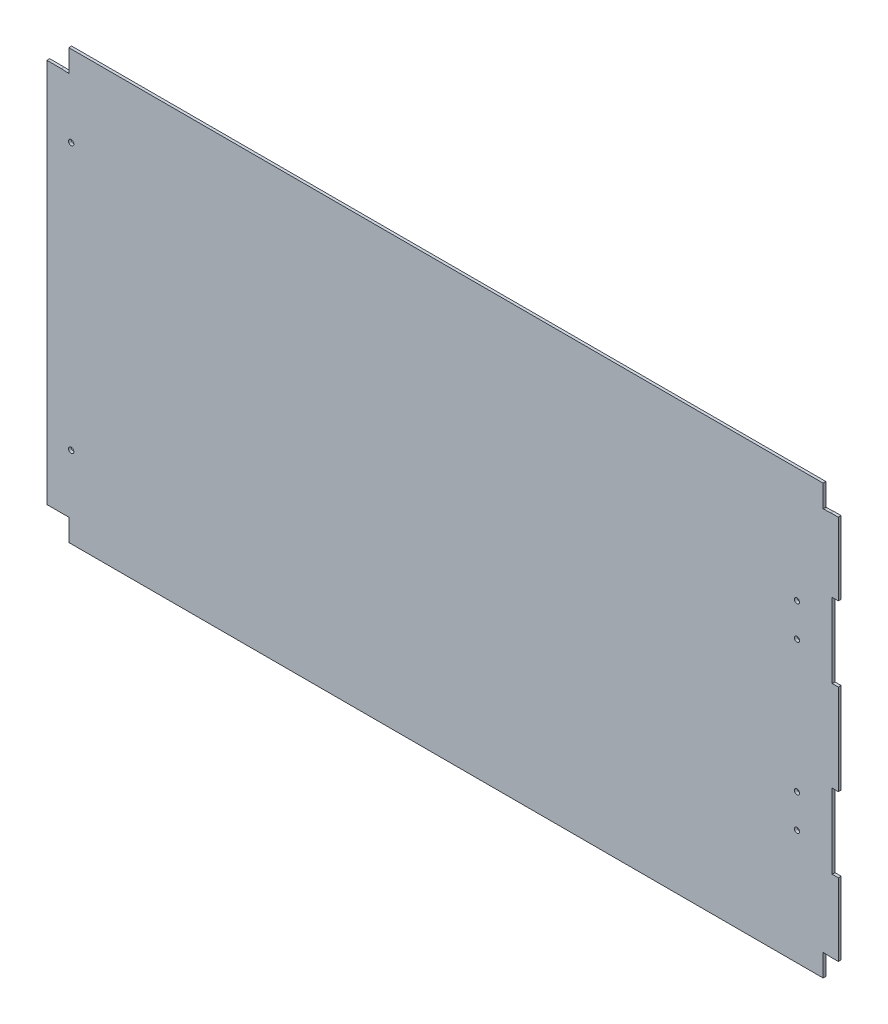
ISO-10303-21;
HEADER;
FILE_DESCRIPTION(('STEP AP214'),'2;1');
FILE_NAME('part.step','',(''),(''),'','','');
FILE_SCHEMA(('AUTOMOTIVE_DESIGN { 1 0 10303 214 1 1 1 1 }'));
ENDSEC;
DATA;
#1=APPLICATION_CONTEXT('core data for automotive mechanical design processes');
#2=APPLICATION_PROTOCOL_DEFINITION('international standard','automotive_design',2000,#1);
#3=PRODUCT_CONTEXT('',#1,'mechanical');
#4=PRODUCT('Part','Part','',(#3));
#5=PRODUCT_RELATED_PRODUCT_CATEGORY('part','',(#4));
#6=PRODUCT_DEFINITION_FORMATION('','',#4);
#7=PRODUCT_DEFINITION_CONTEXT('part definition',#1,'design');
#8=PRODUCT_DEFINITION('design','',#6,#7);
#9=PRODUCT_DEFINITION_SHAPE('','',#8);
#10=(LENGTH_UNIT() NAMED_UNIT(*) SI_UNIT(.MILLI.,.METRE.));
#11=(NAMED_UNIT(*) PLANE_ANGLE_UNIT() SI_UNIT($,.RADIAN.));
#12=(NAMED_UNIT(*) SI_UNIT($,.STERADIAN.) SOLID_ANGLE_UNIT());
#13=UNCERTAINTY_MEASURE_WITH_UNIT(LENGTH_MEASURE(1.E-05),#10,'distance_accuracy_value','');
#14=(GEOMETRIC_REPRESENTATION_CONTEXT(3) GLOBAL_UNCERTAINTY_ASSIGNED_CONTEXT((#13)) GLOBAL_UNIT_ASSIGNED_CONTEXT((#10,
#11,#12)) REPRESENTATION_CONTEXT('',''));
#15=CARTESIAN_POINT('',(0.,0.,0.));
#16=DIRECTION('',(0.,0.,1.));
#17=DIRECTION('',(1.,0.,0.));
#18=AXIS2_PLACEMENT_3D('',#15,#16,#17);
#19=CARTESIAN_POINT('',(0.,0.,-2.667));
#20=DIRECTION('',(0.,0.,-1.));
#21=DIRECTION('',(-1.,0.,0.));
#22=AXIS2_PLACEMENT_3D('',#19,#20,#21);
#23=PLANE('',#22);
#24=CARTESIAN_POINT('',(-357.251,-127.,-2.66700000000004));
#25=DIRECTION('',(0.,0.,1.));
#26=DIRECTION('',(1.,0.,0.));
#27=AXIS2_PLACEMENT_3D('',#24,#25,#26);
#28=CIRCLE('',#27,2.54000000000001);
#29=CARTESIAN_POINT('',(-354.711,-127.,-2.66700000000004));
#30=VERTEX_POINT('',#29);
#31=EDGE_CURVE('E489',#30,#30,#28,.T.);
#32=ORIENTED_EDGE('',*,*,#31,.T.);
#33=EDGE_LOOP('',(#32));
#34=FACE_BOUND('',#33,.T.);
#35=CARTESIAN_POINT('',(334.645,62.992,-2.66700000000004));
#36=DIRECTION('',(0.,0.,1.));
#37=DIRECTION('',(1.,0.,0.));
#38=AXIS2_PLACEMENT_3D('',#35,#36,#37);
#39=CIRCLE('',#38,2.41299999999999);
#40=CARTESIAN_POINT('',(337.058,62.992,-2.66700000000004));
#41=VERTEX_POINT('',#40);
#42=EDGE_CURVE('E512',#41,#41,#39,.T.);
#43=ORIENTED_EDGE('',*,*,#42,.T.);
#44=EDGE_LOOP('',(#43));
#45=FACE_BOUND('',#44,.T.);
#46=CARTESIAN_POINT('',(334.645,-62.9920000000001,-2.66700000000004));
#47=DIRECTION('',(0.,0.,1.));
#48=DIRECTION('',(1.,0.,0.));
#49=AXIS2_PLACEMENT_3D('',#46,#47,#48);
#50=CIRCLE('',#49,2.41299999999999);
#51=CARTESIAN_POINT('',(337.058,-62.9920000000001,-2.66700000000004));
#52=VERTEX_POINT('',#51);
#53=EDGE_CURVE('E497',#52,#52,#50,.T.);
#54=ORIENTED_EDGE('',*,*,#53,.T.);
#55=EDGE_LOOP('',(#54));
#56=FACE_BOUND('',#55,.T.);
#57=CARTESIAN_POINT('',(334.645,-94.7420000000001,-2.66700000000004));
#58=DIRECTION('',(0.,0.,1.));
#59=DIRECTION('',(1.,0.,0.));
#60=AXIS2_PLACEMENT_3D('',#57,#58,#59);
#61=CIRCLE('',#60,2.41299999999999);
#62=CARTESIAN_POINT('',(337.058,-94.7420000000001,-2.66700000000004));
#63=VERTEX_POINT('',#62);
#64=EDGE_CURVE('E498',#63,#63,#61,.T.);
#65=ORIENTED_EDGE('',*,*,#64,.T.);
#66=EDGE_LOOP('',(#65));
#67=FACE_BOUND('',#66,.T.);
#68=CARTESIAN_POINT('',(-357.251,127.,-2.66700000000004));
#69=DIRECTION('',(0.,0.,1.));
#70=DIRECTION('',(1.,0.,0.));
#71=AXIS2_PLACEMENT_3D('',#68,#69,#70);
#72=CIRCLE('',#71,2.54000000000001);
#73=CARTESIAN_POINT('',(-354.711,127.,-2.66700000000004));
#74=VERTEX_POINT('',#73);
#75=EDGE_CURVE('E504',#74,#74,#72,.T.);
#76=ORIENTED_EDGE('',*,*,#75,.T.);
#77=EDGE_LOOP('',(#76));
#78=FACE_BOUND('',#77,.T.);
#79=CARTESIAN_POINT('',(334.645,94.742,-2.66700000000004));
#80=DIRECTION('',(0.,0.,1.));
#81=DIRECTION('',(1.,0.,0.));
#82=AXIS2_PLACEMENT_3D('',#79,#80,#81);
#83=CIRCLE('',#82,2.41299999999999);
#84=CARTESIAN_POINT('',(337.058,94.742,-2.66700000000004));
#85=VERTEX_POINT('',#84);
#86=EDGE_CURVE('E524',#85,#85,#83,.T.);
#87=ORIENTED_EDGE('',*,*,#86,.T.);
#88=EDGE_LOOP('',(#87));
#89=FACE_BOUND('',#88,.T.);
#90=DIRECTION('',(1.,0.,0.));
#91=VECTOR('',#90,1.);
#92=CARTESIAN_POINT('',(0.,183.0705,-2.667));
#93=LINE('',#92,#91);
#94=CARTESIAN_POINT('',(359.537,183.0705,-2.667));
#95=VERTEX_POINT('',#94);
#96=CARTESIAN_POINT('',(360.553,183.0705,-2.66700000000004));
#97=VERTEX_POINT('',#96);
#98=EDGE_CURVE('E527',#95,#97,#93,.T.);
#99=ORIENTED_EDGE('',*,*,#98,.T.);
#100=DIRECTION('',(0.998673606846103,0.0514881247376041,0.));
#101=VECTOR('',#100,1.);
#102=CARTESIAN_POINT('',(360.553,183.0705,-2.66700000000001));
#103=LINE('',#102,#101);
#104=CARTESIAN_POINT('',(366.711291291236,183.388,-2.66700000000001));
#105=VERTEX_POINT('',#104);
#106=EDGE_CURVE('E482',#97,#105,#103,.T.);
#107=ORIENTED_EDGE('',*,*,#106,.T.);
#108=DIRECTION('',(1.,0.,0.));
#109=VECTOR('',#108,1.);
#110=CARTESIAN_POINT('',(364.044291291234,183.388,-2.66700000000003));
#111=LINE('',#110,#109);
#112=CARTESIAN_POINT('',(374.077291291236,183.388,-2.66700000000014));
#113=VERTEX_POINT('',#112);
#114=EDGE_CURVE('E432',#105,#113,#111,.T.);
#115=ORIENTED_EDGE('',*,*,#114,.T.);
#116=DIRECTION('',(0.,-1.,0.));
#117=VECTOR('',#116,1.);
#118=CARTESIAN_POINT('',(374.077291291236,0.,-2.66700000000009));
#119=LINE('',#118,#117);
#120=CARTESIAN_POINT('',(374.077291291236,114.3,-2.66700000000009));
#121=VERTEX_POINT('',#120);
#122=EDGE_CURVE('E429',#113,#121,#119,.T.);
#123=ORIENTED_EDGE('',*,*,#122,.T.);
#124=DIRECTION('',(1.,0.,0.));
#125=VECTOR('',#124,1.);
#126=CARTESIAN_POINT('',(374.077291291236,114.3,-2.66700000000009));
#127=LINE('',#126,#125);
#128=CARTESIAN_POINT('',(368.235291291236,114.3,-2.66699999999997));
#129=VERTEX_POINT('',#128);
#130=EDGE_CURVE('E456',#129,#121,#127,.T.);
#131=ORIENTED_EDGE('',*,*,#130,.F.);
#132=DIRECTION('',(0.,1.,0.));
#133=VECTOR('',#132,1.);
#134=CARTESIAN_POINT('',(368.235291291236,114.3,-2.66699999999997));
#135=LINE('',#134,#133);
#136=CARTESIAN_POINT('',(368.235291291236,43.18,-2.66699999999997));
#137=VERTEX_POINT('',#136);
#138=EDGE_CURVE('E438',#137,#129,#135,.T.);
#139=ORIENTED_EDGE('',*,*,#138,.F.);
#140=DIRECTION('',(-1.,0.,0.));
#141=VECTOR('',#140,1.);
#142=CARTESIAN_POINT('',(374.077291291236,43.18,-2.66700000000009));
#143=LINE('',#142,#141);
#144=CARTESIAN_POINT('',(374.077291291236,43.18,-2.66700000000009));
#145=VERTEX_POINT('',#144);
#146=EDGE_CURVE('E443',#145,#137,#143,.T.);
#147=ORIENTED_EDGE('',*,*,#146,.F.);
#148=CARTESIAN_POINT('',(374.077291291236,-43.1800000000001,-2.66700000000009));
#149=VERTEX_POINT('',#148);
#150=EDGE_CURVE('E434',#145,#149,#119,.T.);
#151=ORIENTED_EDGE('',*,*,#150,.T.);
#152=DIRECTION('',(1.,0.,0.));
#153=VECTOR('',#152,1.);
#154=CARTESIAN_POINT('',(374.077291291236,-43.1800000000001,-2.66700000000009));
#155=LINE('',#154,#153);
#156=CARTESIAN_POINT('',(368.235291291236,-43.1800000000001,-2.66699999999997));
#157=VERTEX_POINT('',#156);
#158=EDGE_CURVE('E458',#157,#149,#155,.T.);
#159=ORIENTED_EDGE('',*,*,#158,.F.);
#160=DIRECTION('',(0.,1.,0.));
#161=VECTOR('',#160,1.);
#162=CARTESIAN_POINT('',(368.235291291236,-114.3,-2.66699999999997));
#163=LINE('',#162,#161);
#164=CARTESIAN_POINT('',(368.235291291236,-114.3,-2.66699999999997));
#165=VERTEX_POINT('',#164);
#166=EDGE_CURVE('E462',#165,#157,#163,.T.);
#167=ORIENTED_EDGE('',*,*,#166,.F.);
#168=DIRECTION('',(-1.,0.,0.));
#169=VECTOR('',#168,1.);
#170=CARTESIAN_POINT('',(374.077291291236,-114.3,-2.66700000000009));
#171=LINE('',#170,#169);
#172=CARTESIAN_POINT('',(374.077291291236,-114.3,-2.66700000000009));
#173=VERTEX_POINT('',#172);
#174=EDGE_CURVE('E467',#173,#165,#171,.T.);
#175=ORIENTED_EDGE('',*,*,#174,.F.);
#176=CARTESIAN_POINT('',(374.077291291236,-183.388,-2.66700000000003));
#177=VERTEX_POINT('',#176);
#178=EDGE_CURVE('E433',#173,#177,#119,.T.);
#179=ORIENTED_EDGE('',*,*,#178,.T.);
#180=DIRECTION('',(-1.,0.,0.));
#181=VECTOR('',#180,1.);
#182=CARTESIAN_POINT('',(364.044291291234,-183.388,-2.66699999999992));
#183=LINE('',#182,#181);
#184=CARTESIAN_POINT('',(366.711291291236,-183.388,-2.66699999999992));
#185=VERTEX_POINT('',#184);
#186=EDGE_CURVE('E436',#177,#185,#183,.T.);
#187=ORIENTED_EDGE('',*,*,#186,.T.);
#188=DIRECTION('',(-0.998673606846104,0.0514881247375951,0.));
#189=VECTOR('',#188,1.);
#190=CARTESIAN_POINT('',(366.711291291236,-183.388,-2.66700000000001));
#191=LINE('',#190,#189);
#192=CARTESIAN_POINT('',(360.553,-183.0705,-2.66700000000001));
#193=VERTEX_POINT('',#192);
#194=EDGE_CURVE('E485',#185,#193,#191,.T.);
#195=ORIENTED_EDGE('',*,*,#194,.T.);
#196=DIRECTION('',(-1.,0.,0.));
#197=VECTOR('',#196,1.);
#198=CARTESIAN_POINT('',(0.,-183.0705,-2.667));
#199=LINE('',#198,#197);
#200=CARTESIAN_POINT('',(359.537,-183.0705,-2.667));
#201=VERTEX_POINT('',#200);
#202=EDGE_CURVE('E545',#193,#201,#199,.T.);
#203=ORIENTED_EDGE('',*,*,#202,.T.);
#204=DIRECTION('',(0.,-1.,0.));
#205=VECTOR('',#204,1.);
#206=CARTESIAN_POINT('',(359.537,-189.738,-2.667));
#207=LINE('',#206,#205);
#208=CARTESIAN_POINT('',(359.537,-204.278291291236,-2.66700000000006));
#209=VERTEX_POINT('',#208);
#210=EDGE_CURVE('E543',#201,#209,#207,.T.);
#211=ORIENTED_EDGE('',*,*,#210,.T.);
#212=DIRECTION('',(1.,0.,0.));
#213=VECTOR('',#212,1.);
#214=CARTESIAN_POINT('',(359.537,-204.278291291236,-2.66700000000006));
#215=LINE('',#214,#213);
#216=CARTESIAN_POINT('',(-359.537,-204.278291291236,-2.66700000000011));
#217=VERTEX_POINT('',#216);
#218=EDGE_CURVE('E372',#217,#209,#215,.T.);
#219=ORIENTED_EDGE('',*,*,#218,.F.);
#220=DIRECTION('',(0.,-1.,0.));
#221=VECTOR('',#220,1.);
#222=CARTESIAN_POINT('',(-359.537,-204.278291291236,-2.66700000000011));
#223=LINE('',#222,#221);
#224=CARTESIAN_POINT('',(-359.537,-190.562291291236,-2.667));
#225=VERTEX_POINT('',#224);
#226=EDGE_CURVE('E379',#225,#217,#223,.T.);
#227=ORIENTED_EDGE('',*,*,#226,.F.);
#228=DIRECTION('',(0.0514881247375944,0.998673606846104,0.));
#229=VECTOR('',#228,1.);
#230=CARTESIAN_POINT('',(-359.537,-190.562291291236,-2.66699999999998));
#231=LINE('',#230,#229);
#232=CARTESIAN_POINT('',(-359.2195,-184.404,-2.66699999999998));
#233=VERTEX_POINT('',#232);
#234=EDGE_CURVE('E394',#225,#233,#231,.T.);
#235=ORIENTED_EDGE('',*,*,#234,.T.);
#236=DIRECTION('',(0.,1.,0.));
#237=VECTOR('',#236,1.);
#238=CARTESIAN_POINT('',(-359.2195,0.,-2.667));
#239=LINE('',#238,#237);
#240=CARTESIAN_POINT('',(-359.2195,-183.388,-2.667));
#241=VERTEX_POINT('',#240);
#242=EDGE_CURVE('E539',#233,#241,#239,.T.);
#243=ORIENTED_EDGE('',*,*,#242,.T.);
#244=DIRECTION('',(-1.,0.,0.));
#245=VECTOR('',#244,1.);
#246=CARTESIAN_POINT('',(-365.887,-183.388,-2.667));
#247=LINE('',#246,#245);
#248=CARTESIAN_POINT('',(-380.427291291236,-183.388,-2.6670000000002));
#249=VERTEX_POINT('',#248);
#250=EDGE_CURVE('E537',#241,#249,#247,.T.);
#251=ORIENTED_EDGE('',*,*,#250,.T.);
#252=DIRECTION('',(0.,-1.,0.));
#253=VECTOR('',#252,1.);
#254=CARTESIAN_POINT('',(-380.427291291236,-183.388,-2.6670000000002));
#255=LINE('',#254,#253);
#256=CARTESIAN_POINT('',(-380.427291291236,183.388,-2.66700000000014));
#257=VERTEX_POINT('',#256);
#258=EDGE_CURVE('E341',#257,#249,#255,.T.);
#259=ORIENTED_EDGE('',*,*,#258,.F.);
#260=DIRECTION('',(-1.,0.,0.));
#261=VECTOR('',#260,1.);
#262=CARTESIAN_POINT('',(-380.427291291236,183.388,-2.66700000000014));
#263=LINE('',#262,#261);
#264=CARTESIAN_POINT('',(-366.711291291236,183.388,-2.66699999999992));
#265=VERTEX_POINT('',#264);
#266=EDGE_CURVE('E354',#265,#257,#263,.T.);
#267=ORIENTED_EDGE('',*,*,#266,.F.);
#268=DIRECTION('',(0.998673606846104,-0.0514881247375861,0.));
#269=VECTOR('',#268,1.);
#270=CARTESIAN_POINT('',(-366.711291291236,183.388,-2.66700000000001));
#271=LINE('',#270,#269);
#272=CARTESIAN_POINT('',(-360.553,183.0705,-2.66700000000001));
#273=VERTEX_POINT('',#272);
#274=EDGE_CURVE('E369',#265,#273,#271,.T.);
#275=ORIENTED_EDGE('',*,*,#274,.T.);
#276=DIRECTION('',(1.,0.,0.));
#277=VECTOR('',#276,1.);
#278=CARTESIAN_POINT('',(0.,183.0705,-2.667));
#279=LINE('',#278,#277);
#280=CARTESIAN_POINT('',(-359.537,183.0705,-2.667));
#281=VERTEX_POINT('',#280);
#282=EDGE_CURVE('E534',#273,#281,#279,.T.);
#283=ORIENTED_EDGE('',*,*,#282,.T.);
#284=DIRECTION('',(0.,1.,0.));
#285=VECTOR('',#284,1.);
#286=CARTESIAN_POINT('',(-359.537,189.738,-2.667));
#287=LINE('',#286,#285);
#288=CARTESIAN_POINT('',(-359.537,204.278291291236,-2.66700000000011));
#289=VERTEX_POINT('',#288);
#290=EDGE_CURVE('E332',#281,#289,#287,.T.);
#291=ORIENTED_EDGE('',*,*,#290,.T.);
#292=DIRECTION('',(-1.,0.,0.));
#293=VECTOR('',#292,1.);
#294=CARTESIAN_POINT('',(-359.537,204.278291291236,-2.66700000000011));
#295=LINE('',#294,#293);
#296=CARTESIAN_POINT('',(359.537,204.278291291236,-2.66700000000011));
#297=VERTEX_POINT('',#296);
#298=EDGE_CURVE('E338',#297,#289,#295,.T.);
#299=ORIENTED_EDGE('',*,*,#298,.F.);
#300=DIRECTION('',(0.,-1.,0.));
#301=VECTOR('',#300,1.);
#302=CARTESIAN_POINT('',(359.537,189.738,-2.667));
#303=LINE('',#302,#301);
#304=EDGE_CURVE('E321',#297,#95,#303,.T.);
#305=ORIENTED_EDGE('',*,*,#304,.T.);
#306=EDGE_LOOP('',(#99,#107,#115,#123,#131,#139,#147,#151,#159,#167,#175,#179,#187,#195,#203,
#211,#219,#227,#235,#243,#251,#259,#267,#275,#283,#291,#299,#305));
#307=FACE_BOUND('',#306,.T.);
#308=ADVANCED_FACE('F135',(#34,#45,#56,#67,#78,#89,#307),#23,.T.);
#309=CARTESIAN_POINT('',(0.,0.,0.));
#310=DIRECTION('',(0.,0.,-1.));
#311=DIRECTION('',(-1.,0.,0.));
#312=AXIS2_PLACEMENT_3D('',#309,#310,#311);
#313=PLANE('',#312);
#314=CARTESIAN_POINT('',(-357.251,-127.,0.));
#315=DIRECTION('',(0.,0.,1.));
#316=DIRECTION('',(1.,0.,0.));
#317=AXIS2_PLACEMENT_3D('',#314,#315,#316);
#318=CIRCLE('',#317,2.54000000000001);
#319=CARTESIAN_POINT('',(-354.711,-127.,0.));
#320=VERTEX_POINT('',#319);
#321=EDGE_CURVE('E507',#320,#320,#318,.T.);
#322=ORIENTED_EDGE('',*,*,#321,.F.);
#323=EDGE_LOOP('',(#322));
#324=FACE_BOUND('',#323,.T.);
#325=CARTESIAN_POINT('',(334.645,62.992,0.));
#326=DIRECTION('',(0.,0.,1.));
#327=DIRECTION('',(1.,0.,0.));
#328=AXIS2_PLACEMENT_3D('',#325,#326,#327);
#329=CIRCLE('',#328,2.41299999999999);
#330=CARTESIAN_POINT('',(337.058,62.992,0.));
#331=VERTEX_POINT('',#330);
#332=EDGE_CURVE('E508',#331,#331,#329,.T.);
#333=ORIENTED_EDGE('',*,*,#332,.F.);
#334=EDGE_LOOP('',(#333));
#335=FACE_BOUND('',#334,.T.);
#336=CARTESIAN_POINT('',(334.645,-62.9920000000001,0.));
#337=DIRECTION('',(0.,0.,1.));
#338=DIRECTION('',(1.,0.,0.));
#339=AXIS2_PLACEMENT_3D('',#336,#337,#338);
#340=CIRCLE('',#339,2.41299999999999);
#341=CARTESIAN_POINT('',(337.058,-62.9920000000001,0.));
#342=VERTEX_POINT('',#341);
#343=EDGE_CURVE('E515',#342,#342,#340,.T.);
#344=ORIENTED_EDGE('',*,*,#343,.F.);
#345=EDGE_LOOP('',(#344));
#346=FACE_BOUND('',#345,.T.);
#347=CARTESIAN_POINT('',(334.645,-94.7420000000001,0.));
#348=DIRECTION('',(0.,0.,1.));
#349=DIRECTION('',(1.,0.,0.));
#350=AXIS2_PLACEMENT_3D('',#347,#348,#349);
#351=CIRCLE('',#350,2.41299999999999);
#352=CARTESIAN_POINT('',(337.058,-94.7420000000001,0.));
#353=VERTEX_POINT('',#352);
#354=EDGE_CURVE('E494',#353,#353,#351,.T.);
#355=ORIENTED_EDGE('',*,*,#354,.F.);
#356=EDGE_LOOP('',(#355));
#357=FACE_BOUND('',#356,.T.);
#358=CARTESIAN_POINT('',(-357.251,127.,0.));
#359=DIRECTION('',(0.,0.,1.));
#360=DIRECTION('',(1.,0.,0.));
#361=AXIS2_PLACEMENT_3D('',#358,#359,#360);
#362=CIRCLE('',#361,2.54000000000001);
#363=CARTESIAN_POINT('',(-354.711,127.,0.));
#364=VERTEX_POINT('',#363);
#365=EDGE_CURVE('E501',#364,#364,#362,.T.);
#366=ORIENTED_EDGE('',*,*,#365,.F.);
#367=EDGE_LOOP('',(#366));
#368=FACE_BOUND('',#367,.T.);
#369=CARTESIAN_POINT('',(334.645,94.742,0.));
#370=DIRECTION('',(0.,0.,1.));
#371=DIRECTION('',(1.,0.,0.));
#372=AXIS2_PLACEMENT_3D('',#369,#370,#371);
#373=CIRCLE('',#372,2.41299999999999);
#374=CARTESIAN_POINT('',(337.058,94.742,0.));
#375=VERTEX_POINT('',#374);
#376=EDGE_CURVE('E511',#375,#375,#373,.T.);
#377=ORIENTED_EDGE('',*,*,#376,.F.);
#378=EDGE_LOOP('',(#377));
#379=FACE_BOUND('',#378,.T.);
#380=DIRECTION('',(-1.,0.,0.));
#381=VECTOR('',#380,1.);
#382=CARTESIAN_POINT('',(360.8705,-183.0705,0.));
#383=LINE('',#382,#381);
#384=CARTESIAN_POINT('',(360.553,-183.0705,0.));
#385=VERTEX_POINT('',#384);
#386=CARTESIAN_POINT('',(359.537,-183.0705,0.));
#387=VERTEX_POINT('',#386);
#388=EDGE_CURVE('E556',#385,#387,#383,.T.);
#389=ORIENTED_EDGE('',*,*,#388,.F.);
#390=DIRECTION('',(-0.998673606846104,0.0514881247375951,0.));
#391=VECTOR('',#390,1.);
#392=CARTESIAN_POINT('',(366.711291291236,-183.388,0.));
#393=LINE('',#392,#391);
#394=CARTESIAN_POINT('',(366.711291291236,-183.388,0.));
#395=VERTEX_POINT('',#394);
#396=EDGE_CURVE('E486',#395,#385,#393,.T.);
#397=ORIENTED_EDGE('',*,*,#396,.F.);
#398=DIRECTION('',(1.,0.,0.));
#399=VECTOR('',#398,1.);
#400=CARTESIAN_POINT('',(364.044291291236,-183.388,0.));
#401=LINE('',#400,#399);
#402=CARTESIAN_POINT('',(374.077291291236,-183.388,0.));
#403=VERTEX_POINT('',#402);
#404=EDGE_CURVE('E400',#403,#395,#401,.F.);
#405=ORIENTED_EDGE('',*,*,#404,.F.);
#406=DIRECTION('',(0.,1.,0.));
#407=VECTOR('',#406,1.);
#408=CARTESIAN_POINT('',(374.077291291236,-183.388,0.));
#409=LINE('',#408,#407);
#410=CARTESIAN_POINT('',(374.077291291236,-114.3,-1.11022302462516E-13));
#411=VERTEX_POINT('',#410);
#412=EDGE_CURVE('E457',#411,#403,#409,.F.);
#413=ORIENTED_EDGE('',*,*,#412,.F.);
#414=DIRECTION('',(-1.,0.,0.));
#415=VECTOR('',#414,1.);
#416=CARTESIAN_POINT('',(374.077291291236,-114.3,-1.11022302462516E-13));
#417=LINE('',#416,#415);
#418=CARTESIAN_POINT('',(368.235291291236,-114.3,0.));
#419=VERTEX_POINT('',#418);
#420=EDGE_CURVE('E415',#411,#419,#417,.T.);
#421=ORIENTED_EDGE('',*,*,#420,.T.);
#422=DIRECTION('',(0.,1.,0.));
#423=VECTOR('',#422,1.);
#424=CARTESIAN_POINT('',(368.235291291236,-114.3,0.));
#425=LINE('',#424,#423);
#426=CARTESIAN_POINT('',(368.235291291236,-43.1800000000001,0.));
#427=VERTEX_POINT('',#426);
#428=EDGE_CURVE('E412',#419,#427,#425,.T.);
#429=ORIENTED_EDGE('',*,*,#428,.T.);
#430=DIRECTION('',(1.,0.,0.));
#431=VECTOR('',#430,1.);
#432=CARTESIAN_POINT('',(374.077291291236,-43.1800000000001,-1.11022302462516E-13));
#433=LINE('',#432,#431);
#434=CARTESIAN_POINT('',(374.077291291236,-43.1800000000001,-1.11022302462516E-13));
#435=VERTEX_POINT('',#434);
#436=EDGE_CURVE('E409',#427,#435,#433,.T.);
#437=ORIENTED_EDGE('',*,*,#436,.T.);
#438=CARTESIAN_POINT('',(374.077291291236,43.18,-1.11022302462516E-13));
#439=VERTEX_POINT('',#438);
#440=EDGE_CURVE('E451',#439,#435,#409,.F.);
#441=ORIENTED_EDGE('',*,*,#440,.F.);
#442=DIRECTION('',(-1.,0.,0.));
#443=VECTOR('',#442,1.);
#444=CARTESIAN_POINT('',(374.077291291236,43.18,-1.11022302462516E-13));
#445=LINE('',#444,#443);
#446=CARTESIAN_POINT('',(368.235291291236,43.18,0.));
#447=VERTEX_POINT('',#446);
#448=EDGE_CURVE('E424',#439,#447,#445,.T.);
#449=ORIENTED_EDGE('',*,*,#448,.T.);
#450=DIRECTION('',(0.,1.,0.));
#451=VECTOR('',#450,1.);
#452=CARTESIAN_POINT('',(368.235291291236,114.3,0.));
#453=LINE('',#452,#451);
#454=CARTESIAN_POINT('',(368.235291291236,114.3,0.));
#455=VERTEX_POINT('',#454);
#456=EDGE_CURVE('E421',#447,#455,#453,.T.);
#457=ORIENTED_EDGE('',*,*,#456,.T.);
#458=DIRECTION('',(1.,0.,0.));
#459=VECTOR('',#458,1.);
#460=CARTESIAN_POINT('',(374.077291291236,114.3,-1.11022302462516E-13));
#461=LINE('',#460,#459);
#462=CARTESIAN_POINT('',(374.077291291236,114.3,-1.11022302462516E-13));
#463=VERTEX_POINT('',#462);
#464=EDGE_CURVE('E418',#455,#463,#461,.T.);
#465=ORIENTED_EDGE('',*,*,#464,.T.);
#466=CARTESIAN_POINT('',(374.077291291236,183.388,-1.66533453693773E-13));
#467=VERTEX_POINT('',#466);
#468=EDGE_CURVE('E452',#467,#463,#409,.F.);
#469=ORIENTED_EDGE('',*,*,#468,.F.);
#470=DIRECTION('',(-1.,0.,0.));
#471=VECTOR('',#470,1.);
#472=CARTESIAN_POINT('',(374.077291291236,183.388,-1.66533453693773E-13));
#473=LINE('',#472,#471);
#474=CARTESIAN_POINT('',(366.711291291236,183.388,0.));
#475=VERTEX_POINT('',#474);
#476=EDGE_CURVE('E427',#475,#467,#473,.F.);
#477=ORIENTED_EDGE('',*,*,#476,.F.);
#478=DIRECTION('',(0.998673606846103,0.0514881247376041,0.));
#479=VECTOR('',#478,1.);
#480=CARTESIAN_POINT('',(360.553,183.0705,0.));
#481=LINE('',#480,#479);
#482=CARTESIAN_POINT('',(360.553,183.0705,0.));
#483=VERTEX_POINT('',#482);
#484=EDGE_CURVE('E402',#483,#475,#481,.T.);
#485=ORIENTED_EDGE('',*,*,#484,.F.);
#486=DIRECTION('',(1.,0.,0.));
#487=VECTOR('',#486,1.);
#488=CARTESIAN_POINT('',(359.537,183.0705,0.));
#489=LINE('',#488,#487);
#490=CARTESIAN_POINT('',(359.537,183.0705,0.));
#491=VERTEX_POINT('',#490);
#492=EDGE_CURVE('E331',#491,#483,#489,.T.);
#493=ORIENTED_EDGE('',*,*,#492,.F.);
#494=DIRECTION('',(0.,-1.,0.));
#495=VECTOR('',#494,1.);
#496=CARTESIAN_POINT('',(359.537,189.738,0.));
#497=LINE('',#496,#495);
#498=CARTESIAN_POINT('',(359.537,204.278291291236,-1.11022302462516E-13));
#499=VERTEX_POINT('',#498);
#500=EDGE_CURVE('E532',#499,#491,#497,.T.);
#501=ORIENTED_EDGE('',*,*,#500,.F.);
#502=DIRECTION('',(1.,0.,0.));
#503=VECTOR('',#502,1.);
#504=CARTESIAN_POINT('',(0.,204.278291291236,-1.11022302462516E-13));
#505=LINE('',#504,#503);
#506=CARTESIAN_POINT('',(-359.537,204.278291291236,-1.11022302462516E-13));
#507=VERTEX_POINT('',#506);
#508=EDGE_CURVE('E340',#499,#507,#505,.F.);
#509=ORIENTED_EDGE('',*,*,#508,.T.);
#510=DIRECTION('',(0.,1.,0.));
#511=VECTOR('',#510,1.);
#512=CARTESIAN_POINT('',(-359.537,189.738,0.));
#513=LINE('',#512,#511);
#514=CARTESIAN_POINT('',(-359.537,183.0705,0.));
#515=VERTEX_POINT('',#514);
#516=EDGE_CURVE('E530',#515,#507,#513,.T.);
#517=ORIENTED_EDGE('',*,*,#516,.F.);
#518=DIRECTION('',(1.,0.,0.));
#519=VECTOR('',#518,1.);
#520=CARTESIAN_POINT('',(-360.8705,183.0705,0.));
#521=LINE('',#520,#519);
#522=CARTESIAN_POINT('',(-360.553,183.0705,0.));
#523=VERTEX_POINT('',#522);
#524=EDGE_CURVE('E150',#523,#515,#521,.T.);
#525=ORIENTED_EDGE('',*,*,#524,.F.);
#526=DIRECTION('',(0.998673606846104,-0.0514881247375861,0.));
#527=VECTOR('',#526,1.);
#528=CARTESIAN_POINT('',(-366.711291291236,183.388,0.));
#529=LINE('',#528,#527);
#530=CARTESIAN_POINT('',(-366.711291291236,183.388,0.));
#531=VERTEX_POINT('',#530);
#532=EDGE_CURVE('E353',#531,#523,#529,.T.);
#533=ORIENTED_EDGE('',*,*,#532,.F.);
#534=DIRECTION('',(1.,0.,0.));
#535=VECTOR('',#534,1.);
#536=CARTESIAN_POINT('',(-364.044291291232,183.388,0.));
#537=LINE('',#536,#535);
#538=CARTESIAN_POINT('',(-380.427291291236,183.388,-1.11022302462516E-13));
#539=VERTEX_POINT('',#538);
#540=EDGE_CURVE('E362',#531,#539,#537,.F.);
#541=ORIENTED_EDGE('',*,*,#540,.T.);
#542=DIRECTION('',(0.,1.,0.));
#543=VECTOR('',#542,1.);
#544=CARTESIAN_POINT('',(-380.427291291236,0.,-1.66533453693773E-13));
#545=LINE('',#544,#543);
#546=CARTESIAN_POINT('',(-380.427291291236,-183.388,-2.22044604925031E-13));
#547=VERTEX_POINT('',#546);
#548=EDGE_CURVE('E359',#539,#547,#545,.F.);
#549=ORIENTED_EDGE('',*,*,#548,.T.);
#550=DIRECTION('',(-1.,0.,0.));
#551=VECTOR('',#550,1.);
#552=CARTESIAN_POINT('',(-365.887,-183.388,0.));
#553=LINE('',#552,#551);
#554=CARTESIAN_POINT('',(-359.2195,-183.388,0.));
#555=VERTEX_POINT('',#554);
#556=EDGE_CURVE('E540',#555,#547,#553,.T.);
#557=ORIENTED_EDGE('',*,*,#556,.F.);
#558=DIRECTION('',(0.,1.,0.));
#559=VECTOR('',#558,1.);
#560=CARTESIAN_POINT('',(-359.2195,-184.7215,0.));
#561=LINE('',#560,#559);
#562=CARTESIAN_POINT('',(-359.2195,-184.404,0.));
#563=VERTEX_POINT('',#562);
#564=EDGE_CURVE('E157',#563,#555,#561,.T.);
#565=ORIENTED_EDGE('',*,*,#564,.F.);
#566=DIRECTION('',(0.0514881247375944,0.998673606846104,0.));
#567=VECTOR('',#566,1.);
#568=CARTESIAN_POINT('',(-359.537,-190.562291291236,0.));
#569=LINE('',#568,#567);
#570=CARTESIAN_POINT('',(-359.537,-190.562291291236,0.));
#571=VERTEX_POINT('',#570);
#572=EDGE_CURVE('E378',#571,#563,#569,.T.);
#573=ORIENTED_EDGE('',*,*,#572,.F.);
#574=DIRECTION('',(0.,1.,0.));
#575=VECTOR('',#574,1.);
#576=CARTESIAN_POINT('',(-359.537,-187.895291291236,0.));
#577=LINE('',#576,#575);
#578=CARTESIAN_POINT('',(-359.537,-204.278291291236,-1.11022302462516E-13));
#579=VERTEX_POINT('',#578);
#580=EDGE_CURVE('E387',#571,#579,#577,.F.);
#581=ORIENTED_EDGE('',*,*,#580,.T.);
#582=DIRECTION('',(-1.,0.,0.));
#583=VECTOR('',#582,1.);
#584=CARTESIAN_POINT('',(0.,-204.278291291236,0.));
#585=LINE('',#584,#583);
#586=CARTESIAN_POINT('',(359.537,-204.278291291236,0.));
#587=VERTEX_POINT('',#586);
#588=EDGE_CURVE('E384',#579,#587,#585,.F.);
#589=ORIENTED_EDGE('',*,*,#588,.T.);
#590=DIRECTION('',(0.,-1.,0.));
#591=VECTOR('',#590,1.);
#592=CARTESIAN_POINT('',(359.537,-189.738,0.));
#593=LINE('',#592,#591);
#594=EDGE_CURVE('E546',#387,#587,#593,.T.);
#595=ORIENTED_EDGE('',*,*,#594,.F.);
#596=EDGE_LOOP('',(#389,#397,#405,#413,#421,#429,#437,#441,#449,#457,#465,#469,#477,#485,#493,
#501,#509,#517,#525,#533,#541,#549,#557,#565,#573,#581,#589,#595));
#597=FACE_BOUND('',#596,.T.);
#598=ADVANCED_FACE('F137',(#324,#335,#346,#357,#368,#379,#597),#313,.F.);
#599=CARTESIAN_POINT('',(359.537,183.0705,0.));
#600=DIRECTION('',(0.,1.,0.));
#601=DIRECTION('',(0.,0.,1.));
#602=AXIS2_PLACEMENT_3D('',#599,#600,#601);
#603=PLANE('',#602);
#604=ORIENTED_EDGE('',*,*,#492,.T.);
#605=DIRECTION('',(0.,0.,-1.));
#606=VECTOR('',#605,1.);
#607=CARTESIAN_POINT('',(360.553,183.0705,0.));
#608=LINE('',#607,#606);
#609=EDGE_CURVE('E554',#483,#97,#608,.T.);
#610=ORIENTED_EDGE('',*,*,#609,.T.);
#611=ORIENTED_EDGE('',*,*,#98,.F.);
#612=DIRECTION('',(0.,0.,-1.));
#613=VECTOR('',#612,1.);
#614=CARTESIAN_POINT('',(359.537,183.0705,0.));
#615=LINE('',#614,#613);
#616=EDGE_CURVE('E327',#491,#95,#615,.T.);
#617=ORIENTED_EDGE('',*,*,#616,.F.);
#618=EDGE_LOOP('',(#604,#610,#611,#617));
#619=FACE_BOUND('',#618,.T.);
#620=ADVANCED_FACE('F646',(#619),#603,.T.);
#621=CARTESIAN_POINT('',(360.8705,-183.0705,0.));
#622=DIRECTION('',(0.,-1.,0.));
#623=DIRECTION('',(0.,0.,-1.));
#624=AXIS2_PLACEMENT_3D('',#621,#622,#623);
#625=PLANE('',#624);
#626=ORIENTED_EDGE('',*,*,#202,.F.);
#627=DIRECTION('',(0.,0.,-1.));
#628=VECTOR('',#627,1.);
#629=CARTESIAN_POINT('',(360.553,-183.0705,0.));
#630=LINE('',#629,#628);
#631=EDGE_CURVE('E568',#385,#193,#630,.T.);
#632=ORIENTED_EDGE('',*,*,#631,.F.);
#633=ORIENTED_EDGE('',*,*,#388,.T.);
#634=DIRECTION('',(0.,0.,-1.));
#635=VECTOR('',#634,1.);
#636=CARTESIAN_POINT('',(359.537,-183.0705,0.));
#637=LINE('',#636,#635);
#638=EDGE_CURVE('E548',#387,#201,#637,.T.);
#639=ORIENTED_EDGE('',*,*,#638,.T.);
#640=EDGE_LOOP('',(#626,#632,#633,#639));
#641=FACE_BOUND('',#640,.T.);
#642=ADVANCED_FACE('F594',(#641),#625,.T.);
#643=CARTESIAN_POINT('',(359.537,-189.738,-2.667));
#644=DIRECTION('',(-1.,0.,0.));
#645=DIRECTION('',(0.,-1.,0.));
#646=AXIS2_PLACEMENT_3D('',#643,#644,#645);
#647=PLANE('',#646);
#648=ORIENTED_EDGE('',*,*,#594,.T.);
#649=DIRECTION('',(0.,0.,1.));
#650=VECTOR('',#649,1.);
#651=CARTESIAN_POINT('',(359.537,-204.278291291236,-2.66700000000006));
#652=LINE('',#651,#650);
#653=EDGE_CURVE('E389',#209,#587,#652,.T.);
#654=ORIENTED_EDGE('',*,*,#653,.F.);
#655=ORIENTED_EDGE('',*,*,#210,.F.);
#656=ORIENTED_EDGE('',*,*,#638,.F.);
#657=EDGE_LOOP('',(#648,#654,#655,#656));
#658=FACE_BOUND('',#657,.T.);
#659=ADVANCED_FACE('F588',(#658),#647,.F.);
#660=CARTESIAN_POINT('',(-359.2195,-184.7215,0.));
#661=DIRECTION('',(-1.,0.,0.));
#662=DIRECTION('',(0.,0.,1.));
#663=AXIS2_PLACEMENT_3D('',#660,#661,#662);
#664=PLANE('',#663);
#665=ORIENTED_EDGE('',*,*,#242,.F.);
#666=DIRECTION('',(0.,0.,-1.));
#667=VECTOR('',#666,1.);
#668=CARTESIAN_POINT('',(-359.2195,-184.404,0.));
#669=LINE('',#668,#667);
#670=EDGE_CURVE('E143',#563,#233,#669,.T.);
#671=ORIENTED_EDGE('',*,*,#670,.F.);
#672=ORIENTED_EDGE('',*,*,#564,.T.);
#673=DIRECTION('',(0.,0.,-1.));
#674=VECTOR('',#673,1.);
#675=CARTESIAN_POINT('',(-359.2195,-183.388,0.));
#676=LINE('',#675,#674);
#677=EDGE_CURVE('E542',#555,#241,#676,.T.);
#678=ORIENTED_EDGE('',*,*,#677,.T.);
#679=EDGE_LOOP('',(#665,#671,#672,#678));
#680=FACE_BOUND('',#679,.T.);
#681=ADVANCED_FACE('F652',(#680),#664,.T.);
#682=CARTESIAN_POINT('',(-365.887,-183.388,-2.667));
#683=DIRECTION('',(0.,1.,0.));
#684=DIRECTION('',(-1.,0.,0.));
#685=AXIS2_PLACEMENT_3D('',#682,#683,#684);
#686=PLANE('',#685);
#687=ORIENTED_EDGE('',*,*,#556,.T.);
#688=DIRECTION('',(0.,0.,1.));
#689=VECTOR('',#688,1.);
#690=CARTESIAN_POINT('',(-380.427291291236,-183.388,-2.66700000000014));
#691=LINE('',#690,#689);
#692=EDGE_CURVE('E364',#249,#547,#691,.T.);
#693=ORIENTED_EDGE('',*,*,#692,.F.);
#694=ORIENTED_EDGE('',*,*,#250,.F.);
#695=ORIENTED_EDGE('',*,*,#677,.F.);
#696=EDGE_LOOP('',(#687,#693,#694,#695));
#697=FACE_BOUND('',#696,.T.);
#698=ADVANCED_FACE('F655',(#697),#686,.F.);
#699=CARTESIAN_POINT('',(-360.8705,183.0705,0.));
#700=DIRECTION('',(0.,1.,0.));
#701=DIRECTION('',(0.,0.,1.));
#702=AXIS2_PLACEMENT_3D('',#699,#700,#701);
#703=PLANE('',#702);
#704=ORIENTED_EDGE('',*,*,#282,.F.);
#705=DIRECTION('',(0.,0.,-1.));
#706=VECTOR('',#705,1.);
#707=CARTESIAN_POINT('',(-360.553,183.0705,0.));
#708=LINE('',#707,#706);
#709=EDGE_CURVE('E13',#523,#273,#708,.T.);
#710=ORIENTED_EDGE('',*,*,#709,.F.);
#711=ORIENTED_EDGE('',*,*,#524,.T.);
#712=DIRECTION('',(0.,0.,-1.));
#713=VECTOR('',#712,1.);
#714=CARTESIAN_POINT('',(-359.537,183.0705,0.));
#715=LINE('',#714,#713);
#716=EDGE_CURVE('E533',#515,#281,#715,.T.);
#717=ORIENTED_EDGE('',*,*,#716,.T.);
#718=EDGE_LOOP('',(#704,#710,#711,#717));
#719=FACE_BOUND('',#718,.T.);
#720=ADVANCED_FACE('F659',(#719),#703,.T.);
#721=CARTESIAN_POINT('',(-359.537,189.738,-2.667));
#722=DIRECTION('',(1.,0.,0.));
#723=DIRECTION('',(0.,0.,-1.));
#724=AXIS2_PLACEMENT_3D('',#721,#722,#723);
#725=PLANE('',#724);
#726=ORIENTED_EDGE('',*,*,#516,.T.);
#727=DIRECTION('',(0.,0.,1.));
#728=VECTOR('',#727,1.);
#729=CARTESIAN_POINT('',(-359.537,204.278291291236,-2.66700000000011));
#730=LINE('',#729,#728);
#731=EDGE_CURVE('E345',#289,#507,#730,.T.);
#732=ORIENTED_EDGE('',*,*,#731,.F.);
#733=ORIENTED_EDGE('',*,*,#290,.F.);
#734=ORIENTED_EDGE('',*,*,#716,.F.);
#735=EDGE_LOOP('',(#726,#732,#733,#734));
#736=FACE_BOUND('',#735,.T.);
#737=ADVANCED_FACE('F662',(#736),#725,.F.);
#738=CARTESIAN_POINT('',(359.537,189.738,-2.667));
#739=DIRECTION('',(-1.,0.,0.));
#740=DIRECTION('',(0.,0.,1.));
#741=AXIS2_PLACEMENT_3D('',#738,#739,#740);
#742=PLANE('',#741);
#743=ORIENTED_EDGE('',*,*,#304,.F.);
#744=DIRECTION('',(0.,0.,1.));
#745=VECTOR('',#744,1.);
#746=CARTESIAN_POINT('',(359.537,204.278291291236,-2.66700000000011));
#747=LINE('',#746,#745);
#748=EDGE_CURVE('E324',#297,#499,#747,.T.);
#749=ORIENTED_EDGE('',*,*,#748,.T.);
#750=ORIENTED_EDGE('',*,*,#500,.T.);
#751=ORIENTED_EDGE('',*,*,#616,.T.);
#752=EDGE_LOOP('',(#743,#749,#750,#751));
#753=FACE_BOUND('',#752,.T.);
#754=ADVANCED_FACE('F323',(#753),#742,.F.);
#755=CARTESIAN_POINT('',(334.645,94.742,-2.66700000000004));
#756=DIRECTION('',(0.,0.,1.));
#757=DIRECTION('',(1.,0.,0.));
#758=AXIS2_PLACEMENT_3D('',#755,#756,#757);
#759=CYLINDRICAL_SURFACE('',#758,2.41299999999999);
#760=ORIENTED_EDGE('',*,*,#86,.F.);
#761=EDGE_LOOP('',(#760));
#762=FACE_BOUND('',#761,.T.);
#763=ORIENTED_EDGE('',*,*,#376,.T.);
#764=EDGE_LOOP('',(#763));
#765=FACE_BOUND('',#764,.T.);
#766=ADVANCED_FACE('F671',(#762,#765),#759,.F.);
#767=CARTESIAN_POINT('',(-357.251,127.,-2.66700000000004));
#768=DIRECTION('',(0.,0.,1.));
#769=DIRECTION('',(1.,0.,0.));
#770=AXIS2_PLACEMENT_3D('',#767,#768,#769);
#771=CYLINDRICAL_SURFACE('',#770,2.54000000000001);
#772=ORIENTED_EDGE('',*,*,#75,.F.);
#773=EDGE_LOOP('',(#772));
#774=FACE_BOUND('',#773,.T.);
#775=ORIENTED_EDGE('',*,*,#365,.T.);
#776=EDGE_LOOP('',(#775));
#777=FACE_BOUND('',#776,.T.);
#778=ADVANCED_FACE('F677',(#774,#777),#771,.F.);
#779=CARTESIAN_POINT('',(334.645,-94.7420000000001,-2.66700000000004));
#780=DIRECTION('',(0.,0.,1.));
#781=DIRECTION('',(1.,0.,0.));
#782=AXIS2_PLACEMENT_3D('',#779,#780,#781);
#783=CYLINDRICAL_SURFACE('',#782,2.41299999999999);
#784=ORIENTED_EDGE('',*,*,#64,.F.);
#785=EDGE_LOOP('',(#784));
#786=FACE_BOUND('',#785,.T.);
#787=ORIENTED_EDGE('',*,*,#354,.T.);
#788=EDGE_LOOP('',(#787));
#789=FACE_BOUND('',#788,.T.);
#790=ADVANCED_FACE('F688',(#786,#789),#783,.F.);
#791=CARTESIAN_POINT('',(334.645,-62.9920000000001,-2.66700000000004));
#792=DIRECTION('',(0.,0.,1.));
#793=DIRECTION('',(1.,0.,0.));
#794=AXIS2_PLACEMENT_3D('',#791,#792,#793);
#795=CYLINDRICAL_SURFACE('',#794,2.41299999999999);
#796=ORIENTED_EDGE('',*,*,#53,.F.);
#797=EDGE_LOOP('',(#796));
#798=FACE_BOUND('',#797,.T.);
#799=ORIENTED_EDGE('',*,*,#343,.T.);
#800=EDGE_LOOP('',(#799));
#801=FACE_BOUND('',#800,.T.);
#802=ADVANCED_FACE('F685',(#798,#801),#795,.F.);
#803=CARTESIAN_POINT('',(334.645,62.992,-2.66700000000004));
#804=DIRECTION('',(0.,0.,1.));
#805=DIRECTION('',(1.,0.,0.));
#806=AXIS2_PLACEMENT_3D('',#803,#804,#805);
#807=CYLINDRICAL_SURFACE('',#806,2.41299999999999);
#808=ORIENTED_EDGE('',*,*,#42,.F.);
#809=EDGE_LOOP('',(#808));
#810=FACE_BOUND('',#809,.T.);
#811=ORIENTED_EDGE('',*,*,#332,.T.);
#812=EDGE_LOOP('',(#811));
#813=FACE_BOUND('',#812,.T.);
#814=ADVANCED_FACE('F683',(#810,#813),#807,.F.);
#815=CARTESIAN_POINT('',(-357.251,-127.,-2.66700000000004));
#816=DIRECTION('',(0.,0.,1.));
#817=DIRECTION('',(1.,0.,0.));
#818=AXIS2_PLACEMENT_3D('',#815,#816,#817);
#819=CYLINDRICAL_SURFACE('',#818,2.54000000000001);
#820=ORIENTED_EDGE('',*,*,#31,.F.);
#821=EDGE_LOOP('',(#820));
#822=FACE_BOUND('',#821,.T.);
#823=ORIENTED_EDGE('',*,*,#321,.T.);
#824=EDGE_LOOP('',(#823));
#825=FACE_BOUND('',#824,.T.);
#826=ADVANCED_FACE('F679',(#822,#825),#819,.F.);
#827=CARTESIAN_POINT('',(360.553,183.0705,-1.41351000000001));
#828=DIRECTION('',(-0.0514881247376041,0.998673606846103,0.));
#829=DIRECTION('',(0.998673606846103,0.0514881247376041,0.));
#830=AXIS2_PLACEMENT_3D('',#827,#828,#829);
#831=PLANE('',#830);
#832=ORIENTED_EDGE('',*,*,#609,.F.);
#833=ORIENTED_EDGE('',*,*,#484,.T.);
#834=DIRECTION('',(0.,0.,-1.));
#835=VECTOR('',#834,1.);
#836=CARTESIAN_POINT('',(366.711291291236,183.388,0.));
#837=LINE('',#836,#835);
#838=EDGE_CURVE('E397',#475,#105,#837,.T.);
#839=ORIENTED_EDGE('',*,*,#838,.T.);
#840=ORIENTED_EDGE('',*,*,#106,.F.);
#841=EDGE_LOOP('',(#832,#833,#839,#840));
#842=FACE_BOUND('',#841,.T.);
#843=ADVANCED_FACE('F682',(#842),#831,.T.);
#844=CARTESIAN_POINT('',(366.711291291236,-183.388,-1.41351000000001));
#845=DIRECTION('',(-0.0514881247375951,-0.998673606846104,0.));
#846=DIRECTION('',(-0.998673606846104,0.0514881247375951,0.));
#847=AXIS2_PLACEMENT_3D('',#844,#845,#846);
#848=PLANE('',#847);
#849=ORIENTED_EDGE('',*,*,#396,.T.);
#850=ORIENTED_EDGE('',*,*,#631,.T.);
#851=ORIENTED_EDGE('',*,*,#194,.F.);
#852=DIRECTION('',(0.,0.,-1.));
#853=VECTOR('',#852,1.);
#854=CARTESIAN_POINT('',(366.711291291236,-183.388,-2.66699999999992));
#855=LINE('',#854,#853);
#856=EDGE_CURVE('E406',#395,#185,#855,.T.);
#857=ORIENTED_EDGE('',*,*,#856,.F.);
#858=EDGE_LOOP('',(#849,#850,#851,#857));
#859=FACE_BOUND('',#858,.T.);
#860=ADVANCED_FACE('F598',(#859),#848,.T.);
#861=CARTESIAN_POINT('',(374.077291291243,114.3,729.108));
#862=DIRECTION('',(0.,1.,0.));
#863=DIRECTION('',(1.,0.,0.));
#864=AXIS2_PLACEMENT_3D('',#861,#862,#863);
#865=PLANE('',#864);
#866=DIRECTION('',(0.,0.,-1.));
#867=VECTOR('',#866,1.);
#868=CARTESIAN_POINT('',(368.235291291243,114.3,729.108));
#869=LINE('',#868,#867);
#870=EDGE_CURVE('E478',#455,#129,#869,.T.);
#871=ORIENTED_EDGE('',*,*,#870,.T.);
#872=ORIENTED_EDGE('',*,*,#130,.T.);
#873=DIRECTION('',(0.,0.,-1.));
#874=VECTOR('',#873,1.);
#875=CARTESIAN_POINT('',(374.077291291243,114.3,729.108));
#876=LINE('',#875,#874);
#877=EDGE_CURVE('E455',#463,#121,#876,.T.);
#878=ORIENTED_EDGE('',*,*,#877,.F.);
#879=ORIENTED_EDGE('',*,*,#464,.F.);
#880=EDGE_LOOP('',(#871,#872,#878,#879));
#881=FACE_BOUND('',#880,.T.);
#882=ADVANCED_FACE('F636',(#881),#865,.F.);
#883=CARTESIAN_POINT('',(374.077291291236,-183.388,-2.66700000000003));
#884=DIRECTION('',(-1.,0.,0.));
#885=DIRECTION('',(0.,0.,1.));
#886=AXIS2_PLACEMENT_3D('',#883,#884,#885);
#887=PLANE('',#886);
#888=ORIENTED_EDGE('',*,*,#468,.T.);
#889=ORIENTED_EDGE('',*,*,#877,.T.);
#890=ORIENTED_EDGE('',*,*,#122,.F.);
#891=DIRECTION('',(0.,0.,1.));
#892=VECTOR('',#891,1.);
#893=CARTESIAN_POINT('',(374.077291291236,183.388,-2.66700000000014));
#894=LINE('',#893,#892);
#895=EDGE_CURVE('E472',#113,#467,#894,.T.);
#896=ORIENTED_EDGE('',*,*,#895,.T.);
#897=EDGE_LOOP('',(#888,#889,#890,#896));
#898=FACE_BOUND('',#897,.T.);
#899=ADVANCED_FACE('F628',(#898),#887,.F.);
#900=ORIENTED_EDGE('',*,*,#178,.F.);
#901=DIRECTION('',(0.,0.,-1.));
#902=VECTOR('',#901,1.);
#903=CARTESIAN_POINT('',(374.077291291243,-114.3,729.108));
#904=LINE('',#903,#902);
#905=EDGE_CURVE('E470',#411,#173,#904,.T.);
#906=ORIENTED_EDGE('',*,*,#905,.F.);
#907=ORIENTED_EDGE('',*,*,#412,.T.);
#908=DIRECTION('',(0.,0.,1.));
#909=VECTOR('',#908,1.);
#910=CARTESIAN_POINT('',(374.077291291236,-183.388,-2.66700000000003));
#911=LINE('',#910,#909);
#912=EDGE_CURVE('E403',#177,#403,#911,.T.);
#913=ORIENTED_EDGE('',*,*,#912,.F.);
#914=EDGE_LOOP('',(#900,#906,#907,#913));
#915=FACE_BOUND('',#914,.T.);
#916=ADVANCED_FACE('F625',(#915),#887,.F.);
#917=CARTESIAN_POINT('',(374.077291291243,-114.3,729.108));
#918=DIRECTION('',(0.,-1.,0.));
#919=DIRECTION('',(-1.,0.,0.));
#920=AXIS2_PLACEMENT_3D('',#917,#918,#919);
#921=PLANE('',#920);
#922=ORIENTED_EDGE('',*,*,#905,.T.);
#923=ORIENTED_EDGE('',*,*,#174,.T.);
#924=DIRECTION('',(0.,0.,-1.));
#925=VECTOR('',#924,1.);
#926=CARTESIAN_POINT('',(368.235291291243,-114.3,729.108));
#927=LINE('',#926,#925);
#928=EDGE_CURVE('E465',#419,#165,#927,.T.);
#929=ORIENTED_EDGE('',*,*,#928,.F.);
#930=ORIENTED_EDGE('',*,*,#420,.F.);
#931=EDGE_LOOP('',(#922,#923,#929,#930));
#932=FACE_BOUND('',#931,.T.);
#933=ADVANCED_FACE('F627',(#932),#921,.F.);
#934=CARTESIAN_POINT('',(368.235291291243,-114.3,729.108));
#935=DIRECTION('',(-1.,0.,0.));
#936=DIRECTION('',(0.,0.,1.));
#937=AXIS2_PLACEMENT_3D('',#934,#935,#936);
#938=PLANE('',#937);
#939=ORIENTED_EDGE('',*,*,#928,.T.);
#940=ORIENTED_EDGE('',*,*,#166,.T.);
#941=DIRECTION('',(0.,0.,-1.));
#942=VECTOR('',#941,1.);
#943=CARTESIAN_POINT('',(368.235291291243,-43.18,729.108));
#944=LINE('',#943,#942);
#945=EDGE_CURVE('E460',#427,#157,#944,.T.);
#946=ORIENTED_EDGE('',*,*,#945,.F.);
#947=ORIENTED_EDGE('',*,*,#428,.F.);
#948=EDGE_LOOP('',(#939,#940,#946,#947));
#949=FACE_BOUND('',#948,.T.);
#950=ADVANCED_FACE('F617',(#949),#938,.F.);
#951=CARTESIAN_POINT('',(374.077291291243,-43.18,729.108));
#952=DIRECTION('',(0.,1.,0.));
#953=DIRECTION('',(1.,0.,0.));
#954=AXIS2_PLACEMENT_3D('',#951,#952,#953);
#955=PLANE('',#954);
#956=ORIENTED_EDGE('',*,*,#945,.T.);
#957=ORIENTED_EDGE('',*,*,#158,.T.);
#958=DIRECTION('',(0.,0.,-1.));
#959=VECTOR('',#958,1.);
#960=CARTESIAN_POINT('',(374.077291291243,-43.18,729.108));
#961=LINE('',#960,#959);
#962=EDGE_CURVE('E448',#435,#149,#961,.T.);
#963=ORIENTED_EDGE('',*,*,#962,.F.);
#964=ORIENTED_EDGE('',*,*,#436,.F.);
#965=EDGE_LOOP('',(#956,#957,#963,#964));
#966=FACE_BOUND('',#965,.T.);
#967=ADVANCED_FACE('F615',(#966),#955,.F.);
#968=ORIENTED_EDGE('',*,*,#150,.F.);
#969=DIRECTION('',(0.,0.,-1.));
#970=VECTOR('',#969,1.);
#971=CARTESIAN_POINT('',(374.077291291243,43.1800000000001,729.108));
#972=LINE('',#971,#970);
#973=EDGE_CURVE('E446',#439,#145,#972,.T.);
#974=ORIENTED_EDGE('',*,*,#973,.F.);
#975=ORIENTED_EDGE('',*,*,#440,.T.);
#976=ORIENTED_EDGE('',*,*,#962,.T.);
#977=EDGE_LOOP('',(#968,#974,#975,#976));
#978=FACE_BOUND('',#977,.T.);
#979=ADVANCED_FACE('F611',(#978),#887,.F.);
#980=CARTESIAN_POINT('',(374.077291291243,43.1800000000001,729.108));
#981=DIRECTION('',(0.,-1.,0.));
#982=DIRECTION('',(-1.,0.,0.));
#983=AXIS2_PLACEMENT_3D('',#980,#981,#982);
#984=PLANE('',#983);
#985=ORIENTED_EDGE('',*,*,#973,.T.);
#986=ORIENTED_EDGE('',*,*,#146,.T.);
#987=DIRECTION('',(0.,0.,-1.));
#988=VECTOR('',#987,1.);
#989=CARTESIAN_POINT('',(368.235291291243,43.1800000000001,729.108));
#990=LINE('',#989,#988);
#991=EDGE_CURVE('E441',#447,#137,#990,.T.);
#992=ORIENTED_EDGE('',*,*,#991,.F.);
#993=ORIENTED_EDGE('',*,*,#448,.F.);
#994=EDGE_LOOP('',(#985,#986,#992,#993));
#995=FACE_BOUND('',#994,.T.);
#996=ADVANCED_FACE('F640',(#995),#984,.F.);
#997=CARTESIAN_POINT('',(368.235291291243,114.3,729.108));
#998=DIRECTION('',(-1.,0.,0.));
#999=DIRECTION('',(0.,0.,1.));
#1000=AXIS2_PLACEMENT_3D('',#997,#998,#999);
#1001=PLANE('',#1000);
#1002=ORIENTED_EDGE('',*,*,#991,.T.);
#1003=ORIENTED_EDGE('',*,*,#138,.T.);
#1004=ORIENTED_EDGE('',*,*,#870,.F.);
#1005=ORIENTED_EDGE('',*,*,#456,.F.);
#1006=EDGE_LOOP('',(#1002,#1003,#1004,#1005));
#1007=FACE_BOUND('',#1006,.T.);
#1008=ADVANCED_FACE('F709',(#1007),#1001,.F.);
#1009=CARTESIAN_POINT('',(374.077291291236,183.388,-2.66700000000014));
#1010=DIRECTION('',(0.,-1.,0.));
#1011=DIRECTION('',(-1.,0.,0.));
#1012=AXIS2_PLACEMENT_3D('',#1009,#1010,#1011);
#1013=PLANE('',#1012);
#1014=ORIENTED_EDGE('',*,*,#838,.F.);
#1015=ORIENTED_EDGE('',*,*,#476,.T.);
#1016=ORIENTED_EDGE('',*,*,#895,.F.);
#1017=ORIENTED_EDGE('',*,*,#114,.F.);
#1018=EDGE_LOOP('',(#1014,#1015,#1016,#1017));
#1019=FACE_BOUND('',#1018,.T.);
#1020=ADVANCED_FACE('F706',(#1019),#1013,.F.);
#1021=CARTESIAN_POINT('',(364.044291291236,-183.388,-2.66699999999992));
#1022=DIRECTION('',(0.,1.,0.));
#1023=DIRECTION('',(1.,0.,0.));
#1024=AXIS2_PLACEMENT_3D('',#1021,#1022,#1023);
#1025=PLANE('',#1024);
#1026=ORIENTED_EDGE('',*,*,#856,.T.);
#1027=ORIENTED_EDGE('',*,*,#186,.F.);
#1028=ORIENTED_EDGE('',*,*,#912,.T.);
#1029=ORIENTED_EDGE('',*,*,#404,.T.);
#1030=EDGE_LOOP('',(#1026,#1027,#1028,#1029));
#1031=FACE_BOUND('',#1030,.T.);
#1032=ADVANCED_FACE('F601',(#1031),#1025,.F.);
#1033=CARTESIAN_POINT('',(-359.537,-190.562291291236,-1.41350999999998));
#1034=DIRECTION('',(-0.998673606846104,0.0514881247375944,0.));
#1035=DIRECTION('',(0.0514881247375944,0.998673606846104,0.));
#1036=AXIS2_PLACEMENT_3D('',#1033,#1034,#1035);
#1037=PLANE('',#1036);
#1038=ORIENTED_EDGE('',*,*,#572,.T.);
#1039=ORIENTED_EDGE('',*,*,#670,.T.);
#1040=ORIENTED_EDGE('',*,*,#234,.F.);
#1041=DIRECTION('',(0.,0.,-1.));
#1042=VECTOR('',#1041,1.);
#1043=CARTESIAN_POINT('',(-359.537,-190.562291291236,-2.667));
#1044=LINE('',#1043,#1042);
#1045=EDGE_CURVE('E381',#571,#225,#1044,.T.);
#1046=ORIENTED_EDGE('',*,*,#1045,.F.);
#1047=EDGE_LOOP('',(#1038,#1039,#1040,#1046));
#1048=FACE_BOUND('',#1047,.T.);
#1049=ADVANCED_FACE('F573',(#1048),#1037,.T.);
#1050=CARTESIAN_POINT('',(359.537,-204.278291291236,-2.66700000000006));
#1051=DIRECTION('',(0.,-1.,0.));
#1052=DIRECTION('',(0.,0.,-1.));
#1053=AXIS2_PLACEMENT_3D('',#1050,#1051,#1052);
#1054=PLANE('',#1053);
#1055=ORIENTED_EDGE('',*,*,#588,.F.);
#1056=DIRECTION('',(0.,0.,1.));
#1057=VECTOR('',#1056,1.);
#1058=CARTESIAN_POINT('',(-359.537,-204.278291291236,-2.66700000000011));
#1059=LINE('',#1058,#1057);
#1060=EDGE_CURVE('E375',#217,#579,#1059,.T.);
#1061=ORIENTED_EDGE('',*,*,#1060,.F.);
#1062=ORIENTED_EDGE('',*,*,#218,.T.);
#1063=ORIENTED_EDGE('',*,*,#653,.T.);
#1064=EDGE_LOOP('',(#1055,#1061,#1062,#1063));
#1065=FACE_BOUND('',#1064,.T.);
#1066=ADVANCED_FACE('F584',(#1065),#1054,.T.);
#1067=CARTESIAN_POINT('',(-359.537,-204.278291291236,-2.66700000000011));
#1068=DIRECTION('',(-1.,0.,0.));
#1069=DIRECTION('',(0.,-1.,0.));
#1070=AXIS2_PLACEMENT_3D('',#1067,#1068,#1069);
#1071=PLANE('',#1070);
#1072=ORIENTED_EDGE('',*,*,#580,.F.);
#1073=ORIENTED_EDGE('',*,*,#1045,.T.);
#1074=ORIENTED_EDGE('',*,*,#226,.T.);
#1075=ORIENTED_EDGE('',*,*,#1060,.T.);
#1076=EDGE_LOOP('',(#1072,#1073,#1074,#1075));
#1077=FACE_BOUND('',#1076,.T.);
#1078=ADVANCED_FACE('F580',(#1077),#1071,.T.);
#1079=CARTESIAN_POINT('',(-366.711291291236,183.388,-1.41351000000001));
#1080=DIRECTION('',(0.0514881247375861,0.998673606846104,0.));
#1081=DIRECTION('',(0.998673606846104,-0.0514881247375861,0.));
#1082=AXIS2_PLACEMENT_3D('',#1079,#1080,#1081);
#1083=PLANE('',#1082);
#1084=ORIENTED_EDGE('',*,*,#532,.T.);
#1085=ORIENTED_EDGE('',*,*,#709,.T.);
#1086=ORIENTED_EDGE('',*,*,#274,.F.);
#1087=DIRECTION('',(0.,0.,-1.));
#1088=VECTOR('',#1087,1.);
#1089=CARTESIAN_POINT('',(-366.711291291236,183.388,-2.66699999999992));
#1090=LINE('',#1089,#1088);
#1091=EDGE_CURVE('E356',#531,#265,#1090,.T.);
#1092=ORIENTED_EDGE('',*,*,#1091,.F.);
#1093=EDGE_LOOP('',(#1084,#1085,#1086,#1092));
#1094=FACE_BOUND('',#1093,.T.);
#1095=ADVANCED_FACE('F778',(#1094),#1083,.T.);
#1096=CARTESIAN_POINT('',(-380.427291291236,-183.388,-2.66700000000014));
#1097=DIRECTION('',(-1.,0.,0.));
#1098=DIRECTION('',(0.,0.,1.));
#1099=AXIS2_PLACEMENT_3D('',#1096,#1097,#1098);
#1100=PLANE('',#1099);
#1101=ORIENTED_EDGE('',*,*,#548,.F.);
#1102=DIRECTION('',(0.,0.,1.));
#1103=VECTOR('',#1102,1.);
#1104=CARTESIAN_POINT('',(-380.427291291236,183.388,-2.66700000000009));
#1105=LINE('',#1104,#1103);
#1106=EDGE_CURVE('E350',#257,#539,#1105,.T.);
#1107=ORIENTED_EDGE('',*,*,#1106,.F.);
#1108=ORIENTED_EDGE('',*,*,#258,.T.);
#1109=ORIENTED_EDGE('',*,*,#692,.T.);
#1110=EDGE_LOOP('',(#1101,#1107,#1108,#1109));
#1111=FACE_BOUND('',#1110,.T.);
#1112=ADVANCED_FACE('F787',(#1111),#1100,.T.);
#1113=CARTESIAN_POINT('',(-380.427291291236,183.388,-2.66700000000009));
#1114=DIRECTION('',(0.,1.,0.));
#1115=DIRECTION('',(-1.,0.,0.));
#1116=AXIS2_PLACEMENT_3D('',#1113,#1114,#1115);
#1117=PLANE('',#1116);
#1118=ORIENTED_EDGE('',*,*,#540,.F.);
#1119=ORIENTED_EDGE('',*,*,#1091,.T.);
#1120=ORIENTED_EDGE('',*,*,#266,.T.);
#1121=ORIENTED_EDGE('',*,*,#1106,.T.);
#1122=EDGE_LOOP('',(#1118,#1119,#1120,#1121));
#1123=FACE_BOUND('',#1122,.T.);
#1124=ADVANCED_FACE('F796',(#1123),#1117,.T.);
#1125=CARTESIAN_POINT('',(-359.537,204.278291291236,-2.66700000000011));
#1126=DIRECTION('',(0.,1.,0.));
#1127=DIRECTION('',(0.,0.,1.));
#1128=AXIS2_PLACEMENT_3D('',#1125,#1126,#1127);
#1129=PLANE('',#1128);
#1130=ORIENTED_EDGE('',*,*,#508,.F.);
#1131=ORIENTED_EDGE('',*,*,#748,.F.);
#1132=ORIENTED_EDGE('',*,*,#298,.T.);
#1133=ORIENTED_EDGE('',*,*,#731,.T.);
#1134=EDGE_LOOP('',(#1130,#1131,#1132,#1133));
#1135=FACE_BOUND('',#1134,.T.);
#1136=ADVANCED_FACE('F336',(#1135),#1129,.T.);
#1137=CLOSED_SHELL('',(#308,#598,#620,#642,#659,#681,#698,#720,#737,#754,#766,#778,#790,#802,
#814,#826,#843,#860,#882,#899,#916,#933,#950,#967,#979,#996,#1008,#1020,#1032,#1049,#1066,#1078,
#1095,#1112,#1124,#1136));
#1138=MANIFOLD_SOLID_BREP('B2',#1137);
#1139=ADVANCED_BREP_SHAPE_REPRESENTATION('',(#18,#1138),#14);
#1140=SHAPE_DEFINITION_REPRESENTATION(#9,#1139);
ENDSEC;
END-ISO-10303-21;
